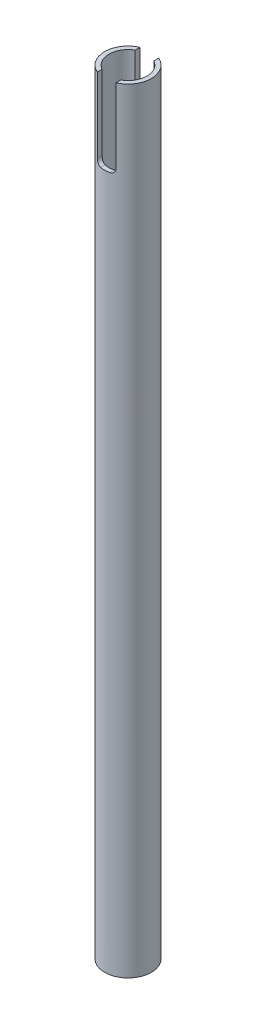
ISO-10303-21;
HEADER;
FILE_DESCRIPTION(('STEP AP214'),'2;1');
FILE_NAME('part.step','',(''),(''),'','','');
FILE_SCHEMA(('AUTOMOTIVE_DESIGN { 1 0 10303 214 1 1 1 1 }'));
ENDSEC;
DATA;
#1=APPLICATION_CONTEXT('core data for automotive mechanical design processes');
#2=APPLICATION_PROTOCOL_DEFINITION('international standard','automotive_design',2000,#1);
#3=PRODUCT_CONTEXT('',#1,'mechanical');
#4=PRODUCT('Part','Part','',(#3));
#5=PRODUCT_RELATED_PRODUCT_CATEGORY('part','',(#4));
#6=PRODUCT_DEFINITION_FORMATION('','',#4);
#7=PRODUCT_DEFINITION_CONTEXT('part definition',#1,'design');
#8=PRODUCT_DEFINITION('design','',#6,#7);
#9=PRODUCT_DEFINITION_SHAPE('','',#8);
#10=(LENGTH_UNIT() NAMED_UNIT(*) SI_UNIT(.MILLI.,.METRE.));
#11=(NAMED_UNIT(*) PLANE_ANGLE_UNIT() SI_UNIT($,.RADIAN.));
#12=(NAMED_UNIT(*) SI_UNIT($,.STERADIAN.) SOLID_ANGLE_UNIT());
#13=UNCERTAINTY_MEASURE_WITH_UNIT(LENGTH_MEASURE(1.E-05),#10,'distance_accuracy_value','');
#14=(GEOMETRIC_REPRESENTATION_CONTEXT(3) GLOBAL_UNCERTAINTY_ASSIGNED_CONTEXT((#13)) GLOBAL_UNIT_ASSIGNED_CONTEXT((#10,
#11,#12)) REPRESENTATION_CONTEXT('',''));
#15=CARTESIAN_POINT('',(0.,0.,0.));
#16=DIRECTION('',(0.,0.,1.));
#17=DIRECTION('',(1.,0.,0.));
#18=AXIS2_PLACEMENT_3D('',#15,#16,#17);
#19=CARTESIAN_POINT('',(-3.175,139.8864847387,0.));
#20=DIRECTION('',(0.,1.,0.));
#21=DIRECTION('',(0.,0.,-1.));
#22=AXIS2_PLACEMENT_3D('',#19,#20,#21);
#23=PLANE('',#22);
#24=DIRECTION('',(0.,0.,1.));
#25=VECTOR('',#24,1.);
#26=CARTESIAN_POINT('',(-3.175,139.8864847387,0.));
#27=LINE('',#26,#25);
#28=CARTESIAN_POINT('',(-3.17499999999999,139.8864847387,-7.2748389157424));
#29=VERTEX_POINT('',#28);
#30=CARTESIAN_POINT('',(-3.17499999999999,139.8864847387,-5.63085690548073));
#31=VERTEX_POINT('',#30);
#32=EDGE_CURVE('E173',#29,#31,#27,.T.);
#33=ORIENTED_EDGE('',*,*,#32,.F.);
#34=CARTESIAN_POINT('',(0.,139.8864847387,0.));
#35=DIRECTION('',(0.,1.,0.));
#36=DIRECTION('',(0.,0.,1.));
#37=AXIS2_PLACEMENT_3D('',#34,#35,#36);
#38=CIRCLE('',#37,7.9375);
#39=CARTESIAN_POINT('',(-3.17499999999999,139.8864847387,7.2748389157424));
#40=VERTEX_POINT('',#39);
#41=EDGE_CURVE('E151',#29,#40,#38,.T.);
#42=ORIENTED_EDGE('',*,*,#41,.T.);
#43=CARTESIAN_POINT('',(-3.17499999999999,139.8864847387,5.63085690548073));
#44=VERTEX_POINT('',#43);
#45=EDGE_CURVE('E171',#44,#40,#27,.T.);
#46=ORIENTED_EDGE('',*,*,#45,.F.);
#47=CARTESIAN_POINT('',(0.,139.8864847387,0.));
#48=DIRECTION('',(0.,1.,0.));
#49=DIRECTION('',(0.,0.,1.));
#50=AXIS2_PLACEMENT_3D('',#47,#48,#49);
#51=CIRCLE('',#50,6.4643);
#52=EDGE_CURVE('E169',#31,#44,#51,.T.);
#53=ORIENTED_EDGE('',*,*,#52,.F.);
#54=EDGE_LOOP('',(#33,#42,#46,#53));
#55=FACE_BOUND('',#54,.T.);
#56=ADVANCED_FACE('F37',(#55),#23,.T.);
#57=CARTESIAN_POINT('',(0.,187.737125041373,0.));
#58=DIRECTION('',(0.,-1.,0.));
#59=DIRECTION('',(0.,0.,-1.));
#60=AXIS2_PLACEMENT_3D('',#57,#58,#59);
#61=CYLINDRICAL_SURFACE('',#60,7.9375);
#62=CARTESIAN_POINT('',(0.,-123.394554532628,0.));
#63=DIRECTION('',(0.,1.,0.));
#64=DIRECTION('',(0.,0.,1.));
#65=AXIS2_PLACEMENT_3D('',#62,#63,#64);
#66=CIRCLE('',#65,7.9375);
#67=CARTESIAN_POINT('',(0.,-123.394554532628,7.9375));
#68=VERTEX_POINT('',#67);
#69=EDGE_CURVE('E154',#68,#68,#66,.T.);
#70=ORIENTED_EDGE('',*,*,#69,.T.);
#71=EDGE_LOOP('',(#70));
#72=FACE_BOUND('',#71,.T.);
#73=CARTESIAN_POINT('',(1.5875,112.8989847387,-7.77712993333659));
#74=CARTESIAN_POINT('',(1.63350676862773,112.89898498229,-7.76774126330065));
#75=CARTESIAN_POINT('',(1.67940359564177,112.900985643407,-7.75794444810861));
#76=CARTESIAN_POINT('',(1.77068039580911,112.908923006726,-7.73762089991974));
#77=CARTESIAN_POINT('',(1.81606050148705,112.914858675474,-7.72709435922087));
#78=CARTESIAN_POINT('',(1.95078228156834,112.938431624725,-7.6945984520111));
#79=CARTESIAN_POINT('',(2.03894812030823,112.961835571647,-7.67166299368629));
#80=CARTESIAN_POINT('',(2.20953807004377,113.023115768819,-7.62428385726793));
#81=CARTESIAN_POINT('',(2.29196515383516,113.060984459079,-7.59984097261638));
#82=CARTESIAN_POINT('',(2.44917385980106,113.150131729121,-7.55064502184106));
#83=CARTESIAN_POINT('',(2.523952278145,113.201415896565,-7.52589183057164));
#84=CARTESIAN_POINT('',(2.66543932718695,113.317402944521,-7.47696931777062));
#85=CARTESIAN_POINT('',(2.73193883493114,113.382371669636,-7.45282414598359));
#86=CARTESIAN_POINT('',(2.85299322074862,113.523509883469,-7.40732925012121));
#87=CARTESIAN_POINT('',(2.90754767783194,113.599679766801,-7.38597962458242));
#88=CARTESIAN_POINT('',(3.00159155783956,113.759253467285,-7.34825600672414));
#89=CARTESIAN_POINT('',(3.04142452291152,113.842427922545,-7.33177064627854));
#90=CARTESIAN_POINT('',(3.10622330269327,114.015198554646,-7.30455577634143));
#91=CARTESIAN_POINT('',(3.13121458917046,114.104783431814,-7.29381640854949));
#92=CARTESIAN_POINT('',(3.15710194076301,114.243831251582,-7.2826300403174));
#93=CARTESIAN_POINT('',(3.1638049583103,114.292086478422,-7.27971714426163));
#94=CARTESIAN_POINT('',(3.17275416759986,114.389045896852,-7.2758193784974));
#95=CARTESIAN_POINT('',(3.17500392571317,114.43774969777,-7.27483296598247));
#96=CARTESIAN_POINT('',(3.17500000000001,114.4864847387,-7.27483891574239));
#97=B_SPLINE_CURVE_WITH_KNOTS('',3,(#73,#74,#75,#76,#77,#78,#79,#80,#81,#82,#83,#84,#85,#86,#87,
#88,#89,#90,#91,#92,#93,#94,#95,#96),.UNSPECIFIED.,.F.,.F.,(4,2,2,2,2,2,2,2,2,2,2,4),(0.,
0.140770845296605,0.281504734514009,0.562238948643032,0.842826637517777,1.12353138019526,
1.41029752992663,1.6970737847845,1.97665708187305,2.25575915194301,2.40195937855946,
2.54804247399299),.UNSPECIFIED.);
#98=CARTESIAN_POINT('',(1.5875,112.8989847387,-7.77712993333659));
#99=VERTEX_POINT('',#98);
#100=CARTESIAN_POINT('',(3.17500000000001,114.4864847387,-7.27483891574239));
#101=VERTEX_POINT('',#100);
#102=EDGE_CURVE('E147',#99,#101,#97,.T.);
#103=ORIENTED_EDGE('',*,*,#102,.T.);
#104=DIRECTION('',(0.,-1.,0.));
#105=VECTOR('',#104,1.);
#106=CARTESIAN_POINT('',(3.17499999999997,187.737125041373,-7.27483891574241));
#107=LINE('',#106,#105);
#108=CARTESIAN_POINT('',(3.175,139.8864847387,-7.2748389157424));
#109=VERTEX_POINT('',#108);
#110=EDGE_CURVE('E134',#101,#109,#107,.F.);
#111=ORIENTED_EDGE('',*,*,#110,.T.);
#112=CARTESIAN_POINT('',(3.175,139.8864847387,7.2748389157424));
#113=VERTEX_POINT('',#112);
#114=EDGE_CURVE('E141',#113,#109,#38,.T.);
#115=ORIENTED_EDGE('',*,*,#114,.F.);
#116=DIRECTION('',(0.,-1.,0.));
#117=VECTOR('',#116,1.);
#118=CARTESIAN_POINT('',(3.17499999999997,187.737125041373,7.27483891574241));
#119=LINE('',#118,#117);
#120=CARTESIAN_POINT('',(3.17500000000001,114.4864847387,7.27483891574239));
#121=VERTEX_POINT('',#120);
#122=EDGE_CURVE('E59',#113,#121,#119,.T.);
#123=ORIENTED_EDGE('',*,*,#122,.T.);
#124=CARTESIAN_POINT('',(3.17500000000001,114.4864847387,7.27483891574239));
#125=CARTESIAN_POINT('',(3.1750016811366,114.444113186718,7.27483586366097));
#126=CARTESIAN_POINT('',(3.1733024516557,114.401763491054,7.27558001702575));
#127=CARTESIAN_POINT('',(3.1665366187788,114.317397676585,7.27852818539399));
#128=CARTESIAN_POINT('',(3.1614710291776,114.275381461203,7.2807317608851));
#129=CARTESIAN_POINT('',(3.14133450163411,114.150599103188,7.28945465778901));
#130=CARTESIAN_POINT('',(3.12132308750016,114.068718784098,7.29808678684576));
#131=CARTESIAN_POINT('',(3.06894040253674,113.909860896098,7.32026684625098));
#132=CARTESIAN_POINT('',(3.03657783085929,113.832879920911,7.33381131641249));
#133=CARTESIAN_POINT('',(2.96061234627717,113.685487340536,7.36480545430105));
#134=CARTESIAN_POINT('',(2.91700139314281,113.615080483694,7.38225791423851));
#135=CARTESIAN_POINT('',(2.81767453343917,113.479406194826,7.42075264717216));
#136=CARTESIAN_POINT('',(2.76150754869702,113.414505185064,7.44191980144857));
#137=CARTESIAN_POINT('',(2.63982081610506,113.294819661358,7.48594933347426));
#138=CARTESIAN_POINT('',(2.57429738653624,113.240039149342,7.50881237683833));
#139=CARTESIAN_POINT('',(2.43069507728356,113.13836176227,7.55656843444929));
#140=CARTESIAN_POINT('',(2.35206470826207,113.092257233294,7.58149355937878));
#141=CARTESIAN_POINT('',(2.18789362747881,113.014091629095,7.63048866953836));
#142=CARTESIAN_POINT('',(2.10235659094264,112.982023142488,7.65455909988381));
#143=CARTESIAN_POINT('',(1.94541809174973,112.938198147715,7.69573507431979));
#144=CARTESIAN_POINT('',(1.8749103784245,112.92356304287,7.71322855066071));
#145=CARTESIAN_POINT('',(1.7321911340129,112.903947281016,7.74654000063456));
#146=CARTESIAN_POINT('',(1.65997981118745,112.898965450052,7.76235817778308));
#147=CARTESIAN_POINT('',(1.5875,112.8989847387,7.77712993333659));
#148=B_SPLINE_CURVE_WITH_KNOTS('',3,(#124,#125,#126,#127,#128,#129,#130,#131,#132,#133,#134,
#135,#136,#137,#138,#139,#140,#141,#142,#143,#144,#145,#146,#147),.UNSPECIFIED.,.F.,.F.,(4,2,2,
2,2,2,2,2,2,2,2,4),(0.,0.127031494291915,0.254024749792393,0.506885265042619,0.759568013575083,
1.01243188015944,1.27651034681326,1.54069301498294,1.82289095795799,2.10493971303589,
2.32661111398099,2.54825555529033),.UNSPECIFIED.);
#149=CARTESIAN_POINT('',(1.5875,112.8989847387,7.77712993333659));
#150=VERTEX_POINT('',#149);
#151=EDGE_CURVE('E157',#121,#150,#148,.T.);
#152=ORIENTED_EDGE('',*,*,#151,.T.);
#153=CARTESIAN_POINT('',(0.,112.8989847387,0.));
#154=DIRECTION('',(0.,-1.,0.));
#155=DIRECTION('',(0.,0.,-1.));
#156=AXIS2_PLACEMENT_3D('',#153,#154,#155);
#157=CIRCLE('',#156,7.9375);
#158=CARTESIAN_POINT('',(-1.58749999999999,112.8989847387,7.77712993333659));
#159=VERTEX_POINT('',#158);
#160=EDGE_CURVE('E223',#150,#159,#157,.T.);
#161=ORIENTED_EDGE('',*,*,#160,.T.);
#162=CARTESIAN_POINT('',(-1.58749999999999,112.8989847387,7.77712993333659));
#163=CARTESIAN_POINT('',(-1.63350676862772,112.89898498229,7.76774126330065));
#164=CARTESIAN_POINT('',(-1.67940359564175,112.900985643407,7.75794444810862));
#165=CARTESIAN_POINT('',(-1.7706803958091,112.908923006726,7.73762089991974));
#166=CARTESIAN_POINT('',(-1.81606050148703,112.914858675474,7.72709435922088));
#167=CARTESIAN_POINT('',(-1.95078228156832,112.938431624725,7.6945984520111));
#168=CARTESIAN_POINT('',(-2.03894812030822,112.961835571647,7.67166299368629));
#169=CARTESIAN_POINT('',(-2.20953807004375,113.023115768819,7.62428385726794));
#170=CARTESIAN_POINT('',(-2.29196515383514,113.060984459079,7.59984097261638));
#171=CARTESIAN_POINT('',(-2.44917385980104,113.150131729121,7.55064502184107));
#172=CARTESIAN_POINT('',(-2.52395227814498,113.201415896565,7.52589183057165));
#173=CARTESIAN_POINT('',(-2.66543932718694,113.317402944521,7.47696931777062));
#174=CARTESIAN_POINT('',(-2.73193883493113,113.382371669636,7.4528241459836));
#175=CARTESIAN_POINT('',(-2.85299322074861,113.523509883469,7.40732925012122));
#176=CARTESIAN_POINT('',(-2.90754767783192,113.599679766801,7.38597962458242));
#177=CARTESIAN_POINT('',(-3.00159155783955,113.759253467285,7.34825600672415));
#178=CARTESIAN_POINT('',(-3.04142452291151,113.842427922545,7.33177064627855));
#179=CARTESIAN_POINT('',(-3.10622330269326,114.015198554646,7.30455577634143));
#180=CARTESIAN_POINT('',(-3.13121458917045,114.104783431814,7.2938164085495));
#181=CARTESIAN_POINT('',(-3.157101940763,114.243831251582,7.28263004031741));
#182=CARTESIAN_POINT('',(-3.16380495831029,114.292086478422,7.27971714426164));
#183=CARTESIAN_POINT('',(-3.17275416759984,114.389045896852,7.2758193784974));
#184=CARTESIAN_POINT('',(-3.17500392571316,114.43774969777,7.27483296598247));
#185=CARTESIAN_POINT('',(-3.175,114.4864847387,7.2748389157424));
#186=B_SPLINE_CURVE_WITH_KNOTS('',3,(#162,#163,#164,#165,#166,#167,#168,#169,#170,#171,#172,
#173,#174,#175,#176,#177,#178,#179,#180,#181,#182,#183,#184,#185),.UNSPECIFIED.,.F.,.F.,(4,2,2,
2,2,2,2,2,2,2,2,4),(0.,0.140770845296603,0.281504734514007,0.562238948643032,0.842826637517776,
1.12353138019525,1.41029752992663,1.69707378478449,1.97665708187307,2.25575915194301,
2.40195937855946,2.54804247399299),.UNSPECIFIED.);
#187=CARTESIAN_POINT('',(-3.175,114.4864847387,7.2748389157424));
#188=VERTEX_POINT('',#187);
#189=EDGE_CURVE('E213',#159,#188,#186,.T.);
#190=ORIENTED_EDGE('',*,*,#189,.T.);
#191=DIRECTION('',(0.,-1.,0.));
#192=VECTOR('',#191,1.);
#193=CARTESIAN_POINT('',(-3.17499999999998,187.737125041373,7.2748389157424));
#194=LINE('',#193,#192);
#195=EDGE_CURVE('E277',#188,#40,#194,.F.);
#196=ORIENTED_EDGE('',*,*,#195,.T.);
#197=ORIENTED_EDGE('',*,*,#41,.F.);
#198=DIRECTION('',(0.,-1.,0.));
#199=VECTOR('',#198,1.);
#200=CARTESIAN_POINT('',(-3.17499999999998,187.737125041373,-7.2748389157424));
#201=LINE('',#200,#199);
#202=CARTESIAN_POINT('',(-3.175,114.4864847387,-7.2748389157424));
#203=VERTEX_POINT('',#202);
#204=EDGE_CURVE('E214',#29,#203,#201,.T.);
#205=ORIENTED_EDGE('',*,*,#204,.T.);
#206=CARTESIAN_POINT('',(-3.175,114.4864847387,-7.2748389157424));
#207=CARTESIAN_POINT('',(-3.17500168113659,114.444113186718,-7.27483586366098));
#208=CARTESIAN_POINT('',(-3.17330245165568,114.401763491054,-7.27558001702575));
#209=CARTESIAN_POINT('',(-3.16653661877879,114.317397676585,-7.27852818539399));
#210=CARTESIAN_POINT('',(-3.16147102917759,114.275381461203,-7.28073176088511));
#211=CARTESIAN_POINT('',(-3.14133450163409,114.150599103188,-7.28945465778901));
#212=CARTESIAN_POINT('',(-3.12132308750015,114.068718784098,-7.29808678684577));
#213=CARTESIAN_POINT('',(-3.06894040253672,113.909860896098,-7.32026684625098));
#214=CARTESIAN_POINT('',(-3.03657783085928,113.832879920911,-7.3338113164125));
#215=CARTESIAN_POINT('',(-2.96061234627716,113.685487340536,-7.36480545430105));
#216=CARTESIAN_POINT('',(-2.9170013931428,113.615080483694,-7.38225791423852));
#217=CARTESIAN_POINT('',(-2.81767453343915,113.479406194826,-7.42075264717216));
#218=CARTESIAN_POINT('',(-2.76150754869701,113.414505185064,-7.44191980144858));
#219=CARTESIAN_POINT('',(-2.63982081610505,113.294819661358,-7.48594933347426));
#220=CARTESIAN_POINT('',(-2.57429738653623,113.240039149342,-7.50881237683833));
#221=CARTESIAN_POINT('',(-2.43069507728354,113.13836176227,-7.55656843444929));
#222=CARTESIAN_POINT('',(-2.35206470826205,113.092257233294,-7.58149355937878));
#223=CARTESIAN_POINT('',(-2.1878936274788,113.014091629095,-7.63048866953836));
#224=CARTESIAN_POINT('',(-2.10235659094263,112.982023142488,-7.65455909988382));
#225=CARTESIAN_POINT('',(-1.94541809174971,112.938198147715,-7.69573507431979));
#226=CARTESIAN_POINT('',(-1.87491037842448,112.92356304287,-7.71322855066072));
#227=CARTESIAN_POINT('',(-1.73219113401289,112.903947281016,-7.74654000063457));
#228=CARTESIAN_POINT('',(-1.65997981118743,112.898965450052,-7.76235817778308));
#229=CARTESIAN_POINT('',(-1.58749999999999,112.8989847387,-7.77712993333659));
#230=B_SPLINE_CURVE_WITH_KNOTS('',3,(#206,#207,#208,#209,#210,#211,#212,#213,#214,#215,#216,
#217,#218,#219,#220,#221,#222,#223,#224,#225,#226,#227,#228,#229),.UNSPECIFIED.,.F.,.F.,(4,2,2,
2,2,2,2,2,2,2,2,4),(0.,0.127031494291915,0.254024749792393,0.506885265042619,0.759568013575084,
1.01243188015944,1.27651034681325,1.54069301498294,1.82289095795799,2.10493971303589,
2.32661111398098,2.54825555529033),.UNSPECIFIED.);
#231=CARTESIAN_POINT('',(-1.58749999999999,112.8989847387,-7.77712993333659));
#232=VERTEX_POINT('',#231);
#233=EDGE_CURVE('E206',#203,#232,#230,.T.);
#234=ORIENTED_EDGE('',*,*,#233,.T.);
#235=EDGE_CURVE('E222',#232,#99,#157,.T.);
#236=ORIENTED_EDGE('',*,*,#235,.T.);
#237=EDGE_LOOP('',(#103,#111,#115,#123,#152,#161,#190,#196,#197,#205,#234,#236));
#238=FACE_BOUND('',#237,.T.);
#239=ADVANCED_FACE('F39',(#72,#238),#61,.T.);
#240=CARTESIAN_POINT('',(0.,-123.394554532628,0.));
#241=DIRECTION('',(0.,1.,0.));
#242=DIRECTION('',(0.,0.,1.));
#243=AXIS2_PLACEMENT_3D('',#240,#241,#242);
#244=PLANE('',#243);
#245=ORIENTED_EDGE('',*,*,#69,.F.);
#246=EDGE_LOOP('',(#245));
#247=FACE_BOUND('',#246,.T.);
#248=CARTESIAN_POINT('',(0.,-123.394554532628,0.));
#249=DIRECTION('',(0.,1.,0.));
#250=DIRECTION('',(0.,0.,1.));
#251=AXIS2_PLACEMENT_3D('',#248,#249,#250);
#252=CIRCLE('',#251,6.4643);
#253=CARTESIAN_POINT('',(0.,-123.394554532628,6.4643));
#254=VERTEX_POINT('',#253);
#255=EDGE_CURVE('E163',#254,#254,#252,.T.);
#256=ORIENTED_EDGE('',*,*,#255,.T.);
#257=EDGE_LOOP('',(#256));
#258=FACE_BOUND('',#257,.T.);
#259=ADVANCED_FACE('F312',(#247,#258),#244,.F.);
#260=CARTESIAN_POINT('',(0.,187.737125041373,0.));
#261=DIRECTION('',(0.,-1.,0.));
#262=DIRECTION('',(0.,0.,-1.));
#263=AXIS2_PLACEMENT_3D('',#260,#261,#262);
#264=CYLINDRICAL_SURFACE('',#263,6.4643);
#265=DIRECTION('',(0.,-1.,0.));
#266=VECTOR('',#265,1.);
#267=CARTESIAN_POINT('',(-3.17499999999998,187.737125041373,5.63085690548074));
#268=LINE('',#267,#266);
#269=CARTESIAN_POINT('',(-3.175,114.4864847387,5.63085690548073));
#270=VERTEX_POINT('',#269);
#271=EDGE_CURVE('E270',#270,#44,#268,.F.);
#272=ORIENTED_EDGE('',*,*,#271,.F.);
#273=CARTESIAN_POINT('',(-1.58749999999999,112.8989847387,6.26634009929241));
#274=CARTESIAN_POINT('',(-1.63418900680278,112.898984960115,6.25451519937794));
#275=CARTESIAN_POINT('',(-1.6807162115009,112.901045252656,6.2421690242475));
#276=CARTESIAN_POINT('',(-1.77313930969813,112.90919366434,6.21654599792507));
#277=CARTESIAN_POINT('',(-1.81903543834436,112.915280239306,6.20326950527711));
#278=CARTESIAN_POINT('',(-1.95507469082072,112.939391163055,6.16228683989148));
#279=CARTESIAN_POINT('',(-2.04387534201677,112.963267981993,6.13334935224698));
#280=CARTESIAN_POINT('',(-2.21532061503981,113.025552688341,6.07353181019978));
#281=CARTESIAN_POINT('',(-2.29797173444354,113.063944970122,6.04265387160463));
#282=CARTESIAN_POINT('',(-2.45546303738963,113.154179924016,5.98038883139863));
#283=CARTESIAN_POINT('',(-2.53029702370294,113.206033155837,5.94900134826912));
#284=CARTESIAN_POINT('',(-2.67287075398233,113.324156872709,5.88635884745835));
#285=CARTESIAN_POINT('',(-2.74025626996523,113.390880758348,5.85514963173659));
#286=CARTESIAN_POINT('',(-2.86271368076049,113.53621801972,5.79626340236597));
#287=CARTESIAN_POINT('',(-2.91778558227084,113.614831388985,5.76858638679577));
#288=CARTESIAN_POINT('',(-3.01168872656629,113.779053323231,5.72010524984432));
#289=CARTESIAN_POINT('',(-3.05104502216775,113.864295926571,5.69908490291319));
#290=CARTESIAN_POINT('',(-3.11430373465245,114.04169672105,5.66476886814871));
#291=CARTESIAN_POINT('',(-3.13824572360375,114.133836520393,5.6514534090763));
#292=CARTESIAN_POINT('',(-3.16081362599346,114.270329528268,5.63883740321027));
#293=CARTESIAN_POINT('',(-3.16612512648615,114.313338275334,5.63585394797714));
#294=CARTESIAN_POINT('',(-3.1732182894863,114.399716315938,5.63186201493137));
#295=CARTESIAN_POINT('',(-3.17500157254309,114.443085434757,5.63085263040865));
#296=CARTESIAN_POINT('',(-3.175,114.4864847387,5.63085690548073));
#297=B_SPLINE_CURVE_WITH_KNOTS('',3,(#273,#274,#275,#276,#277,#278,#279,#280,#281,#282,#283,
#284,#285,#286,#287,#288,#289,#290,#291,#292,#293,#294,#295,#296),.UNSPECIFIED.,.F.,.F.,(4,2,2,
2,2,2,2,2,2,2,2,4),(0.,0.144388740940302,0.288722137366156,0.576452128922379,0.863873656489902,
1.15152134248762,1.44956694911566,1.74761239362144,2.0346413785876,2.32093052452346,
2.4510816078904,2.58117289753276),.UNSPECIFIED.);
#298=CARTESIAN_POINT('',(-1.58749999999999,112.8989847387,6.26634009929241));
#299=VERTEX_POINT('',#298);
#300=EDGE_CURVE('E200',#299,#270,#297,.T.);
#301=ORIENTED_EDGE('',*,*,#300,.F.);
#302=CARTESIAN_POINT('',(0.,112.8989847387,0.));
#303=DIRECTION('',(0.,-1.,0.));
#304=DIRECTION('',(0.,0.,-1.));
#305=AXIS2_PLACEMENT_3D('',#302,#303,#304);
#306=CIRCLE('',#305,6.4643);
#307=CARTESIAN_POINT('',(1.5875,112.8989847387,6.26634009929241));
#308=VERTEX_POINT('',#307);
#309=EDGE_CURVE('E52',#308,#299,#306,.T.);
#310=ORIENTED_EDGE('',*,*,#309,.F.);
#311=CARTESIAN_POINT('',(3.17500000000001,114.4864847387,5.63085690548072));
#312=CARTESIAN_POINT('',(3.17500265942432,114.445327908025,5.63085243150938));
#313=CARTESIAN_POINT('',(3.17339835018607,114.404193385851,5.63176028239596));
#314=CARTESIAN_POINT('',(3.16701766507688,114.32226757051,5.6353521570195));
#315=CARTESIAN_POINT('',(3.16224273305132,114.281476129669,5.63803537228504));
#316=CARTESIAN_POINT('',(3.14329664507895,114.160480902895,5.64863522411122));
#317=CARTESIAN_POINT('',(3.12450305374456,114.081168850454,5.65910325483872));
#318=CARTESIAN_POINT('',(3.07549165040551,113.927418955956,5.68588522764517));
#319=CARTESIAN_POINT('',(3.04528974537461,113.852974495636,5.7021910282914));
#320=CARTESIAN_POINT('',(2.97460119282056,113.71030687464,5.73938277272117));
#321=CARTESIAN_POINT('',(2.93410271969421,113.642090990749,5.76027397904373));
#322=CARTESIAN_POINT('',(2.84103773378422,113.508813022489,5.80676804025646));
#323=CARTESIAN_POINT('',(2.78784532739573,113.444266860427,5.83259254506421));
#324=CARTESIAN_POINT('',(2.67254263369962,113.324700150389,5.88631786935967));
#325=CARTESIAN_POINT('',(2.61042818908354,113.269684069555,5.91421965383982));
#326=CARTESIAN_POINT('',(2.47143371409537,113.164667221248,5.97373371686978));
#327=CARTESIAN_POINT('',(2.39368295701584,113.115856801692,6.00542032126396));
#328=CARTESIAN_POINT('',(2.23068225215682,113.032229403642,6.06785364975219));
#329=CARTESIAN_POINT('',(2.14543609512392,112.997405400669,6.09860083846706));
#330=CARTESIAN_POINT('',(1.98216120584023,112.946808127037,6.15341243852268));
#331=CARTESIAN_POINT('',(1.90486553835026,112.929011216101,6.17780100436402));
#332=CARTESIAN_POINT('',(1.74771289593288,112.905082048292,6.22410888754503));
#333=CARTESIAN_POINT('',(1.66785396509172,112.898958925208,6.24602625877211));
#334=CARTESIAN_POINT('',(1.5875,112.8989847387,6.26634009929241));
#335=B_SPLINE_CURVE_WITH_KNOTS('',3,(#311,#312,#313,#314,#315,#316,#317,#318,#319,#320,#321,
#322,#323,#324,#325,#326,#327,#328,#329,#330,#331,#332,#333,#334),.UNSPECIFIED.,.F.,.F.,(4,2,2,
2,2,2,2,2,2,2,2,4),(0.,0.123386261727179,0.246716374037833,0.491934980105696,0.736812924701857,
0.981973392060174,1.24352761602776,1.50520411142377,1.79524970866348,2.08514945193375,
2.33322496948238,2.58149450643058),.UNSPECIFIED.);
#336=CARTESIAN_POINT('',(3.17500000000001,114.4864847387,5.63085690548072));
#337=VERTEX_POINT('',#336);
#338=EDGE_CURVE('E12',#337,#308,#335,.T.);
#339=ORIENTED_EDGE('',*,*,#338,.F.);
#340=DIRECTION('',(0.,-1.,0.));
#341=VECTOR('',#340,1.);
#342=CARTESIAN_POINT('',(3.17499999999997,187.737125041373,5.63085690548074));
#343=LINE('',#342,#341);
#344=CARTESIAN_POINT('',(3.175,139.8864847387,5.63085690548073));
#345=VERTEX_POINT('',#344);
#346=EDGE_CURVE('E148',#345,#337,#343,.T.);
#347=ORIENTED_EDGE('',*,*,#346,.F.);
#348=CARTESIAN_POINT('',(3.175,139.8864847387,-5.63085690548073));
#349=VERTEX_POINT('',#348);
#350=EDGE_CURVE('E166',#345,#349,#51,.T.);
#351=ORIENTED_EDGE('',*,*,#350,.T.);
#352=DIRECTION('',(0.,-1.,0.));
#353=VECTOR('',#352,1.);
#354=CARTESIAN_POINT('',(3.17499999999997,187.737125041373,-5.63085690548074));
#355=LINE('',#354,#353);
#356=CARTESIAN_POINT('',(3.17500000000001,114.4864847387,-5.63085690548072));
#357=VERTEX_POINT('',#356);
#358=EDGE_CURVE('E67',#357,#349,#355,.F.);
#359=ORIENTED_EDGE('',*,*,#358,.F.);
#360=CARTESIAN_POINT('',(1.5875,112.8989847387,-6.26634009929241));
#361=CARTESIAN_POINT('',(1.63418900680279,112.898984960115,-6.25451519937794));
#362=CARTESIAN_POINT('',(1.68071621150092,112.901045252656,-6.2421690242475));
#363=CARTESIAN_POINT('',(1.77313930969814,112.90919366434,-6.21654599792506));
#364=CARTESIAN_POINT('',(1.81903543834438,112.915280239306,-6.20326950527711));
#365=CARTESIAN_POINT('',(1.95507469082073,112.939391163055,-6.16228683989147));
#366=CARTESIAN_POINT('',(2.04387534201678,112.963267981993,-6.13334935224697));
#367=CARTESIAN_POINT('',(2.21532061503982,113.025552688341,-6.07353181019978));
#368=CARTESIAN_POINT('',(2.29797173444355,113.063944970122,-6.04265387160463));
#369=CARTESIAN_POINT('',(2.45546303738964,113.154179924016,-5.98038883139863));
#370=CARTESIAN_POINT('',(2.53029702370295,113.206033155837,-5.94900134826912));
#371=CARTESIAN_POINT('',(2.67287075398234,113.324156872709,-5.88635884745834));
#372=CARTESIAN_POINT('',(2.74025626996524,113.390880758348,-5.85514963173659));
#373=CARTESIAN_POINT('',(2.8627136807605,113.53621801972,-5.79626340236597));
#374=CARTESIAN_POINT('',(2.91778558227086,113.614831388985,-5.76858638679577));
#375=CARTESIAN_POINT('',(3.0116887265663,113.779053323231,-5.72010524984432));
#376=CARTESIAN_POINT('',(3.05104502216776,113.864295926571,-5.69908490291319));
#377=CARTESIAN_POINT('',(3.11430373465246,114.04169672105,-5.6647688681487));
#378=CARTESIAN_POINT('',(3.13824572360377,114.133836520393,-5.65145340907629));
#379=CARTESIAN_POINT('',(3.16081362599347,114.270329528268,-5.63883740321026));
#380=CARTESIAN_POINT('',(3.16612512648617,114.313338275334,-5.63585394797714));
#381=CARTESIAN_POINT('',(3.17321828948631,114.399716315938,-5.63186201493137));
#382=CARTESIAN_POINT('',(3.17500157254311,114.443085434757,-5.63085263040864));
#383=CARTESIAN_POINT('',(3.17500000000001,114.4864847387,-5.63085690548072));
#384=B_SPLINE_CURVE_WITH_KNOTS('',3,(#360,#361,#362,#363,#364,#365,#366,#367,#368,#369,#370,
#371,#372,#373,#374,#375,#376,#377,#378,#379,#380,#381,#382,#383),.UNSPECIFIED.,.F.,.F.,(4,2,2,
2,2,2,2,2,2,2,2,4),(0.,0.144388740940302,0.288722137366156,0.576452128922379,0.863873656489902,
1.15152134248762,1.44956694911566,1.74761239362144,2.03464137858758,2.32093052452346,
2.4510816078904,2.58117289753276),.UNSPECIFIED.);
#385=CARTESIAN_POINT('',(1.5875,112.8989847387,-6.26634009929241));
#386=VERTEX_POINT('',#385);
#387=EDGE_CURVE('E237',#386,#357,#384,.T.);
#388=ORIENTED_EDGE('',*,*,#387,.F.);
#389=CARTESIAN_POINT('',(-1.58749999999999,112.8989847387,-6.26634009929241));
#390=VERTEX_POINT('',#389);
#391=EDGE_CURVE('E181',#390,#386,#306,.T.);
#392=ORIENTED_EDGE('',*,*,#391,.F.);
#393=CARTESIAN_POINT('',(-3.175,114.4864847387,-5.63085690548073));
#394=CARTESIAN_POINT('',(-3.17500265942431,114.445327908025,-5.63085243150939));
#395=CARTESIAN_POINT('',(-3.17339835018606,114.404193385851,-5.63176028239597));
#396=CARTESIAN_POINT('',(-3.16701766507687,114.32226757051,-5.6353521570195));
#397=CARTESIAN_POINT('',(-3.1622427330513,114.281476129669,-5.63803537228504));
#398=CARTESIAN_POINT('',(-3.14329664507894,114.160480902895,-5.64863522411123));
#399=CARTESIAN_POINT('',(-3.12450305374455,114.081168850454,-5.65910325483873));
#400=CARTESIAN_POINT('',(-3.07549165040549,113.927418955956,-5.68588522764517));
#401=CARTESIAN_POINT('',(-3.0452897453746,113.852974495636,-5.70219102829141));
#402=CARTESIAN_POINT('',(-2.97460119282055,113.71030687464,-5.73938277272118));
#403=CARTESIAN_POINT('',(-2.9341027196942,113.642090990749,-5.76027397904373));
#404=CARTESIAN_POINT('',(-2.8410377337842,113.508813022489,-5.80676804025647));
#405=CARTESIAN_POINT('',(-2.78784532739572,113.444266860427,-5.83259254506422));
#406=CARTESIAN_POINT('',(-2.67254263369961,113.324700150389,-5.88631786935968));
#407=CARTESIAN_POINT('',(-2.61042818908352,113.269684069555,-5.91421965383983));
#408=CARTESIAN_POINT('',(-2.47143371409535,113.164667221248,-5.97373371686979));
#409=CARTESIAN_POINT('',(-2.39368295701582,113.115856801692,-6.00542032126396));
#410=CARTESIAN_POINT('',(-2.2306822521568,113.032229403642,-6.0678536497522));
#411=CARTESIAN_POINT('',(-2.1454360951239,112.997405400669,-6.09860083846706));
#412=CARTESIAN_POINT('',(-1.98216120584022,112.946808127037,-6.15341243852268));
#413=CARTESIAN_POINT('',(-1.90486553835025,112.929011216101,-6.17780100436403));
#414=CARTESIAN_POINT('',(-1.74771289593287,112.905082048292,-6.22410888754504));
#415=CARTESIAN_POINT('',(-1.66785396509171,112.898958925208,-6.24602625877211));
#416=CARTESIAN_POINT('',(-1.58749999999999,112.8989847387,-6.26634009929241));
#417=B_SPLINE_CURVE_WITH_KNOTS('',3,(#393,#394,#395,#396,#397,#398,#399,#400,#401,#402,#403,
#404,#405,#406,#407,#408,#409,#410,#411,#412,#413,#414,#415,#416),.UNSPECIFIED.,.F.,.F.,(4,2,2,
2,2,2,2,2,2,2,2,4),(0.,0.123386261727179,0.246716374037833,0.491934980105696,0.736812924701841,
0.981973392060173,1.24352761602776,1.50520411142377,1.7952497086635,2.08514945193375,
2.33322496948238,2.58149450643058),.UNSPECIFIED.);
#418=CARTESIAN_POINT('',(-3.175,114.4864847387,-5.63085690548073));
#419=VERTEX_POINT('',#418);
#420=EDGE_CURVE('E174',#419,#390,#417,.T.);
#421=ORIENTED_EDGE('',*,*,#420,.F.);
#422=DIRECTION('',(0.,-1.,0.));
#423=VECTOR('',#422,1.);
#424=CARTESIAN_POINT('',(-3.17499999999998,187.737125041373,-5.63085690548074));
#425=LINE('',#424,#423);
#426=EDGE_CURVE('E275',#31,#419,#425,.T.);
#427=ORIENTED_EDGE('',*,*,#426,.F.);
#428=ORIENTED_EDGE('',*,*,#52,.T.);
#429=EDGE_LOOP('',(#272,#301,#310,#339,#347,#351,#359,#388,#392,#421,#427,#428));
#430=FACE_BOUND('',#429,.T.);
#431=ORIENTED_EDGE('',*,*,#255,.F.);
#432=EDGE_LOOP('',(#431));
#433=FACE_BOUND('',#432,.T.);
#434=ADVANCED_FACE('F183',(#430,#433),#264,.F.);
#435=DIRECTION('',(0.,0.,-1.));
#436=VECTOR('',#435,1.);
#437=CARTESIAN_POINT('',(3.175,139.8864847387,0.));
#438=LINE('',#437,#436);
#439=EDGE_CURVE('E140',#113,#345,#438,.T.);
#440=ORIENTED_EDGE('',*,*,#439,.F.);
#441=ORIENTED_EDGE('',*,*,#114,.T.);
#442=EDGE_CURVE('E131',#349,#109,#438,.T.);
#443=ORIENTED_EDGE('',*,*,#442,.F.);
#444=ORIENTED_EDGE('',*,*,#350,.F.);
#445=EDGE_LOOP('',(#440,#441,#443,#444));
#446=FACE_BOUND('',#445,.T.);
#447=ADVANCED_FACE('F150',(#446),#23,.T.);
#448=CARTESIAN_POINT('',(3.175,139.8864847387,-7.9375));
#449=DIRECTION('',(1.,0.,0.));
#450=DIRECTION('',(0.,1.,0.));
#451=AXIS2_PLACEMENT_3D('',#448,#449,#450);
#452=PLANE('',#451);
#453=DIRECTION('',(0.,0.,1.));
#454=VECTOR('',#453,1.);
#455=CARTESIAN_POINT('',(3.17500000000001,114.4864847387,-7.9375));
#456=LINE('',#455,#454);
#457=EDGE_CURVE('E292',#101,#357,#456,.T.);
#458=ORIENTED_EDGE('',*,*,#457,.T.);
#459=ORIENTED_EDGE('',*,*,#358,.T.);
#460=ORIENTED_EDGE('',*,*,#442,.T.);
#461=ORIENTED_EDGE('',*,*,#110,.F.);
#462=EDGE_LOOP('',(#458,#459,#460,#461));
#463=FACE_BOUND('',#462,.T.);
#464=ADVANCED_FACE('F133',(#463),#452,.F.);
#465=CARTESIAN_POINT('',(-3.17499999999999,139.8864847387,-7.9375));
#466=DIRECTION('',(-1.,0.,0.));
#467=DIRECTION('',(0.,-1.,0.));
#468=AXIS2_PLACEMENT_3D('',#465,#466,#467);
#469=PLANE('',#468);
#470=ORIENTED_EDGE('',*,*,#32,.T.);
#471=ORIENTED_EDGE('',*,*,#426,.T.);
#472=DIRECTION('',(0.,0.,1.));
#473=VECTOR('',#472,1.);
#474=CARTESIAN_POINT('',(-3.175,114.4864847387,-7.9375));
#475=LINE('',#474,#473);
#476=EDGE_CURVE('E265',#203,#419,#475,.T.);
#477=ORIENTED_EDGE('',*,*,#476,.F.);
#478=ORIENTED_EDGE('',*,*,#204,.F.);
#479=EDGE_LOOP('',(#470,#471,#477,#478));
#480=FACE_BOUND('',#479,.T.);
#481=ADVANCED_FACE('F195',(#480),#469,.F.);
#482=CARTESIAN_POINT('',(-1.58749999999999,114.4864847387,-7.9375));
#483=DIRECTION('',(0.,0.,1.));
#484=DIRECTION('',(1.,0.,0.));
#485=AXIS2_PLACEMENT_3D('',#482,#483,#484);
#486=CYLINDRICAL_SURFACE('',#485,1.58750000000001);
#487=ORIENTED_EDGE('',*,*,#476,.T.);
#488=ORIENTED_EDGE('',*,*,#420,.T.);
#489=DIRECTION('',(0.,0.,1.));
#490=VECTOR('',#489,1.);
#491=CARTESIAN_POINT('',(-1.58749999999999,112.8989847387,-7.9375));
#492=LINE('',#491,#490);
#493=EDGE_CURVE('E264',#232,#390,#492,.T.);
#494=ORIENTED_EDGE('',*,*,#493,.F.);
#495=ORIENTED_EDGE('',*,*,#233,.F.);
#496=EDGE_LOOP('',(#487,#488,#494,#495));
#497=FACE_BOUND('',#496,.T.);
#498=ADVANCED_FACE('F194',(#497),#486,.F.);
#499=CARTESIAN_POINT('',(-1.58749999999999,112.8989847387,-7.9375));
#500=DIRECTION('',(0.,-1.,0.));
#501=DIRECTION('',(0.,0.,-1.));
#502=AXIS2_PLACEMENT_3D('',#499,#500,#501);
#503=PLANE('',#502);
#504=ORIENTED_EDGE('',*,*,#235,.F.);
#505=ORIENTED_EDGE('',*,*,#493,.T.);
#506=ORIENTED_EDGE('',*,*,#391,.T.);
#507=DIRECTION('',(0.,0.,1.));
#508=VECTOR('',#507,1.);
#509=CARTESIAN_POINT('',(1.5875,112.8989847387,-7.9375));
#510=LINE('',#509,#508);
#511=EDGE_CURVE('E293',#99,#386,#510,.T.);
#512=ORIENTED_EDGE('',*,*,#511,.F.);
#513=EDGE_LOOP('',(#504,#505,#506,#512));
#514=FACE_BOUND('',#513,.T.);
#515=ADVANCED_FACE('F303',(#514),#503,.F.);
#516=CARTESIAN_POINT('',(1.5875,114.4864847387,-7.9375));
#517=DIRECTION('',(0.,0.,1.));
#518=DIRECTION('',(1.,0.,0.));
#519=AXIS2_PLACEMENT_3D('',#516,#517,#518);
#520=CYLINDRICAL_SURFACE('',#519,1.58750000000001);
#521=ORIENTED_EDGE('',*,*,#511,.T.);
#522=ORIENTED_EDGE('',*,*,#387,.T.);
#523=ORIENTED_EDGE('',*,*,#457,.F.);
#524=ORIENTED_EDGE('',*,*,#102,.F.);
#525=EDGE_LOOP('',(#521,#522,#523,#524));
#526=FACE_BOUND('',#525,.T.);
#527=ADVANCED_FACE('F232',(#526),#520,.F.);
#528=EDGE_CURVE('E290',#337,#121,#456,.T.);
#529=ORIENTED_EDGE('',*,*,#528,.F.);
#530=ORIENTED_EDGE('',*,*,#338,.T.);
#531=EDGE_CURVE('E257',#308,#150,#510,.T.);
#532=ORIENTED_EDGE('',*,*,#531,.T.);
#533=ORIENTED_EDGE('',*,*,#151,.F.);
#534=EDGE_LOOP('',(#529,#530,#532,#533));
#535=FACE_BOUND('',#534,.T.);
#536=ADVANCED_FACE('F228',(#535),#520,.F.);
#537=ORIENTED_EDGE('',*,*,#531,.F.);
#538=ORIENTED_EDGE('',*,*,#309,.T.);
#539=EDGE_CURVE('E255',#299,#159,#492,.T.);
#540=ORIENTED_EDGE('',*,*,#539,.T.);
#541=ORIENTED_EDGE('',*,*,#160,.F.);
#542=EDGE_LOOP('',(#537,#538,#540,#541));
#543=FACE_BOUND('',#542,.T.);
#544=ADVANCED_FACE('F192',(#543),#503,.F.);
#545=ORIENTED_EDGE('',*,*,#539,.F.);
#546=ORIENTED_EDGE('',*,*,#300,.T.);
#547=EDGE_CURVE('E297',#270,#188,#475,.T.);
#548=ORIENTED_EDGE('',*,*,#547,.T.);
#549=ORIENTED_EDGE('',*,*,#189,.F.);
#550=EDGE_LOOP('',(#545,#546,#548,#549));
#551=FACE_BOUND('',#550,.T.);
#552=ADVANCED_FACE('F186',(#551),#486,.F.);
#553=ORIENTED_EDGE('',*,*,#547,.F.);
#554=ORIENTED_EDGE('',*,*,#271,.T.);
#555=ORIENTED_EDGE('',*,*,#45,.T.);
#556=ORIENTED_EDGE('',*,*,#195,.F.);
#557=EDGE_LOOP('',(#553,#554,#555,#556));
#558=FACE_BOUND('',#557,.T.);
#559=ADVANCED_FACE('F191',(#558),#469,.F.);
#560=ORIENTED_EDGE('',*,*,#439,.T.);
#561=ORIENTED_EDGE('',*,*,#346,.T.);
#562=ORIENTED_EDGE('',*,*,#528,.T.);
#563=ORIENTED_EDGE('',*,*,#122,.F.);
#564=EDGE_LOOP('',(#560,#561,#562,#563));
#565=FACE_BOUND('',#564,.T.);
#566=ADVANCED_FACE('F234',(#565),#452,.F.);
#567=CLOSED_SHELL('',(#56,#239,#259,#434,#447,#464,#481,#498,#515,#527,#536,#544,#552,#559,#566));
#568=MANIFOLD_SOLID_BREP('B2',#567);
#569=ADVANCED_BREP_SHAPE_REPRESENTATION('',(#18,#568),#14);
#570=SHAPE_DEFINITION_REPRESENTATION(#9,#569);
ENDSEC;
END-ISO-10303-21;
